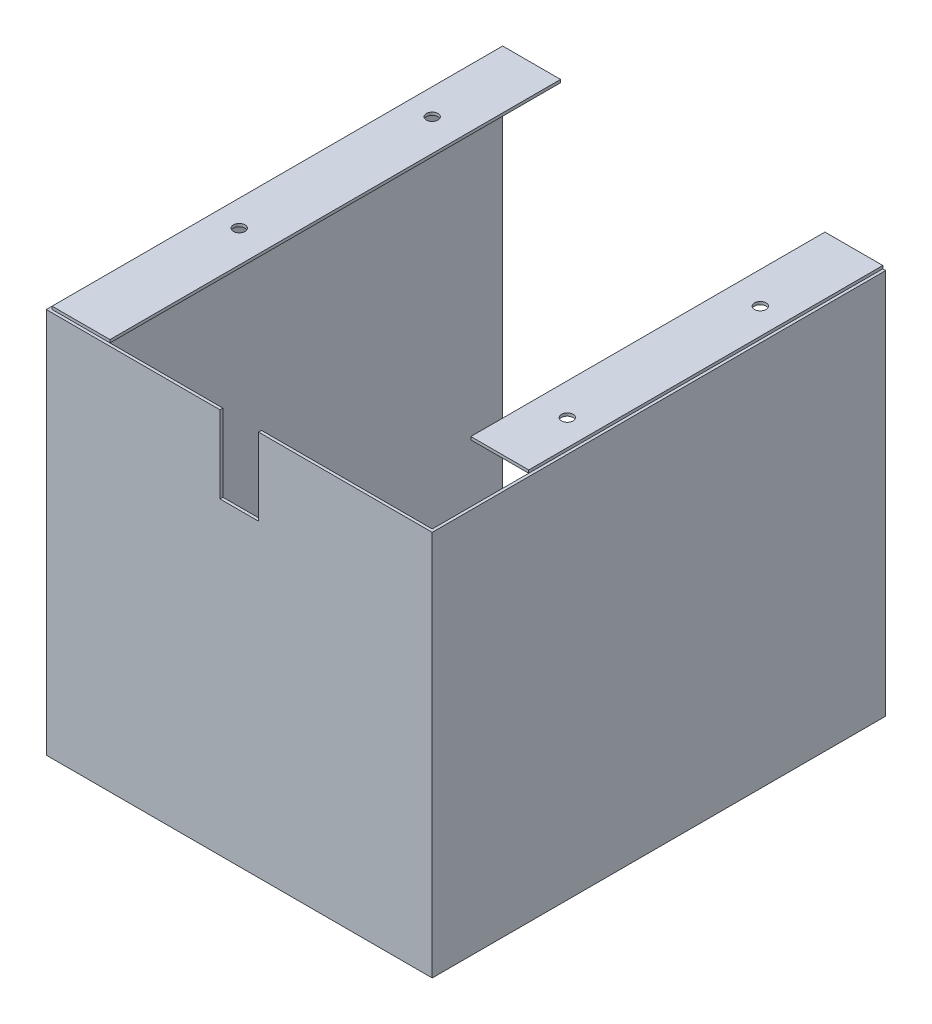
ISO-10303-21;
HEADER;
FILE_DESCRIPTION(('STEP AP214'),'2;1');
FILE_NAME('part.step','',(''),(''),'','','');
FILE_SCHEMA(('AUTOMOTIVE_DESIGN { 1 0 10303 214 1 1 1 1 }'));
ENDSEC;
DATA;
#1=APPLICATION_CONTEXT('core data for automotive mechanical design processes');
#2=APPLICATION_PROTOCOL_DEFINITION('international standard','automotive_design',2000,#1);
#3=PRODUCT_CONTEXT('',#1,'mechanical');
#4=PRODUCT('Part','Part','',(#3));
#5=PRODUCT_RELATED_PRODUCT_CATEGORY('part','',(#4));
#6=PRODUCT_DEFINITION_FORMATION('','',#4);
#7=PRODUCT_DEFINITION_CONTEXT('part definition',#1,'design');
#8=PRODUCT_DEFINITION('design','',#6,#7);
#9=PRODUCT_DEFINITION_SHAPE('','',#8);
#10=(LENGTH_UNIT() NAMED_UNIT(*) SI_UNIT(.MILLI.,.METRE.));
#11=(NAMED_UNIT(*) PLANE_ANGLE_UNIT() SI_UNIT($,.RADIAN.));
#12=(NAMED_UNIT(*) SI_UNIT($,.STERADIAN.) SOLID_ANGLE_UNIT());
#13=UNCERTAINTY_MEASURE_WITH_UNIT(LENGTH_MEASURE(1.E-05),#10,'distance_accuracy_value','');
#14=(GEOMETRIC_REPRESENTATION_CONTEXT(3) GLOBAL_UNCERTAINTY_ASSIGNED_CONTEXT((#13)) GLOBAL_UNIT_ASSIGNED_CONTEXT((#10,
#11,#12)) REPRESENTATION_CONTEXT('',''));
#15=CARTESIAN_POINT('',(0.,0.,0.));
#16=DIRECTION('',(0.,0.,1.));
#17=DIRECTION('',(1.,0.,0.));
#18=AXIS2_PLACEMENT_3D('',#15,#16,#17);
#19=CARTESIAN_POINT('',(98.5,101.5,0.));
#20=DIRECTION('',(-1.,0.,0.));
#21=DIRECTION('',(0.,-1.,0.));
#22=AXIS2_PLACEMENT_3D('',#19,#20,#21);
#23=PLANE('',#22);
#24=DIRECTION('',(0.,0.,-1.));
#25=VECTOR('',#24,1.);
#26=CARTESIAN_POINT('',(98.5,100.,0.));
#27=LINE('',#26,#25);
#28=CARTESIAN_POINT('',(98.5,100.,183.5));
#29=VERTEX_POINT('',#28);
#30=CARTESIAN_POINT('',(98.5,100.,0.));
#31=VERTEX_POINT('',#30);
#32=EDGE_CURVE('E117',#29,#31,#27,.T.);
#33=ORIENTED_EDGE('',*,*,#32,.T.);
#34=DIRECTION('',(0.,-1.,0.));
#35=VECTOR('',#34,1.);
#36=CARTESIAN_POINT('',(98.5,101.5,0.));
#37=LINE('',#36,#35);
#38=CARTESIAN_POINT('',(98.5,101.5,0.));
#39=VERTEX_POINT('',#38);
#40=EDGE_CURVE('E12',#39,#31,#37,.T.);
#41=ORIENTED_EDGE('',*,*,#40,.F.);
#42=DIRECTION('',(0.,0.,-1.));
#43=VECTOR('',#42,1.);
#44=CARTESIAN_POINT('',(98.5,101.5,0.));
#45=LINE('',#44,#43);
#46=CARTESIAN_POINT('',(98.5,101.5,183.5));
#47=VERTEX_POINT('',#46);
#48=EDGE_CURVE('E105',#47,#39,#45,.T.);
#49=ORIENTED_EDGE('',*,*,#48,.F.);
#50=DIRECTION('',(0.,-1.,0.));
#51=VECTOR('',#50,1.);
#52=CARTESIAN_POINT('',(98.5,101.5,183.5));
#53=LINE('',#52,#51);
#54=EDGE_CURVE('E113',#47,#29,#53,.T.);
#55=ORIENTED_EDGE('',*,*,#54,.T.);
#56=EDGE_LOOP('',(#33,#41,#49,#55));
#57=FACE_BOUND('',#56,.T.);
#58=ADVANCED_FACE('F54',(#57),#23,.F.);
#59=CARTESIAN_POINT('',(98.5,101.5,0.));
#60=DIRECTION('',(0.,0.,1.));
#61=DIRECTION('',(1.,0.,0.));
#62=AXIS2_PLACEMENT_3D('',#59,#60,#61);
#63=PLANE('',#62);
#64=DIRECTION('',(-1.,0.,0.));
#65=VECTOR('',#64,1.);
#66=CARTESIAN_POINT('',(98.5,100.,0.));
#67=LINE('',#66,#65);
#68=CARTESIAN_POINT('',(68.5,100.,0.));
#69=VERTEX_POINT('',#68);
#70=EDGE_CURVE('E109',#31,#69,#67,.T.);
#71=ORIENTED_EDGE('',*,*,#70,.T.);
#72=DIRECTION('',(0.,-1.,0.));
#73=VECTOR('',#72,1.);
#74=CARTESIAN_POINT('',(68.5,101.5,0.));
#75=LINE('',#74,#73);
#76=CARTESIAN_POINT('',(68.5,101.5,0.));
#77=VERTEX_POINT('',#76);
#78=EDGE_CURVE('E62',#77,#69,#75,.T.);
#79=ORIENTED_EDGE('',*,*,#78,.F.);
#80=DIRECTION('',(-1.,0.,0.));
#81=VECTOR('',#80,1.);
#82=CARTESIAN_POINT('',(98.5,101.5,0.));
#83=LINE('',#82,#81);
#84=EDGE_CURVE('E100',#39,#77,#83,.T.);
#85=ORIENTED_EDGE('',*,*,#84,.F.);
#86=ORIENTED_EDGE('',*,*,#40,.T.);
#87=EDGE_LOOP('',(#71,#79,#85,#86));
#88=FACE_BOUND('',#87,.T.);
#89=ADVANCED_FACE('F108',(#88),#63,.F.);
#90=CARTESIAN_POINT('',(68.5,101.5,0.));
#91=DIRECTION('',(1.,0.,0.));
#92=DIRECTION('',(0.,0.,-1.));
#93=AXIS2_PLACEMENT_3D('',#90,#91,#92);
#94=PLANE('',#93);
#95=DIRECTION('',(0.,0.,1.));
#96=VECTOR('',#95,1.);
#97=CARTESIAN_POINT('',(68.5,100.,0.));
#98=LINE('',#97,#96);
#99=CARTESIAN_POINT('',(68.5,100.,183.5));
#100=VERTEX_POINT('',#99);
#101=EDGE_CURVE('E87',#69,#100,#98,.T.);
#102=ORIENTED_EDGE('',*,*,#101,.T.);
#103=DIRECTION('',(0.,-1.,0.));
#104=VECTOR('',#103,1.);
#105=CARTESIAN_POINT('',(68.5,101.5,183.5));
#106=LINE('',#105,#104);
#107=CARTESIAN_POINT('',(68.5,101.5,183.5));
#108=VERTEX_POINT('',#107);
#109=EDGE_CURVE('E110',#108,#100,#106,.T.);
#110=ORIENTED_EDGE('',*,*,#109,.F.);
#111=DIRECTION('',(0.,0.,1.));
#112=VECTOR('',#111,1.);
#113=CARTESIAN_POINT('',(68.5,101.5,0.));
#114=LINE('',#113,#112);
#115=EDGE_CURVE('E103',#77,#108,#114,.T.);
#116=ORIENTED_EDGE('',*,*,#115,.F.);
#117=ORIENTED_EDGE('',*,*,#78,.T.);
#118=EDGE_LOOP('',(#102,#110,#116,#117));
#119=FACE_BOUND('',#118,.T.);
#120=ADVANCED_FACE('F111',(#119),#94,.F.);
#121=CARTESIAN_POINT('',(68.5,101.5,183.5));
#122=DIRECTION('',(0.,0.,-1.));
#123=DIRECTION('',(-1.,0.,0.));
#124=AXIS2_PLACEMENT_3D('',#121,#122,#123);
#125=PLANE('',#124);
#126=DIRECTION('',(1.,0.,0.));
#127=VECTOR('',#126,1.);
#128=CARTESIAN_POINT('',(68.5,100.,183.5));
#129=LINE('',#128,#127);
#130=EDGE_CURVE('E93',#100,#29,#129,.T.);
#131=ORIENTED_EDGE('',*,*,#130,.T.);
#132=ORIENTED_EDGE('',*,*,#54,.F.);
#133=DIRECTION('',(1.,0.,0.));
#134=VECTOR('',#133,1.);
#135=CARTESIAN_POINT('',(68.5,101.5,183.5));
#136=LINE('',#135,#134);
#137=EDGE_CURVE('E70',#108,#47,#136,.T.);
#138=ORIENTED_EDGE('',*,*,#137,.F.);
#139=ORIENTED_EDGE('',*,*,#109,.T.);
#140=EDGE_LOOP('',(#131,#132,#138,#139));
#141=FACE_BOUND('',#140,.T.);
#142=ADVANCED_FACE('F125',(#141),#125,.F.);
#143=CARTESIAN_POINT('',(0.,101.5,0.));
#144=DIRECTION('',(0.,1.,0.));
#145=DIRECTION('',(0.,0.,1.));
#146=AXIS2_PLACEMENT_3D('',#143,#144,#145);
#147=PLANE('',#146);
#148=CARTESIAN_POINT('',(85.0000000000001,101.5,150.));
#149=DIRECTION('',(0.,1.,0.));
#150=DIRECTION('',(0.,0.,-1.));
#151=AXIS2_PLACEMENT_3D('',#148,#149,#150);
#152=CIRCLE('',#151,3.00000000000001);
#153=CARTESIAN_POINT('',(85.0000000000001,101.5,147.));
#154=VERTEX_POINT('',#153);
#155=EDGE_CURVE('E137',#154,#154,#152,.T.);
#156=ORIENTED_EDGE('',*,*,#155,.F.);
#157=EDGE_LOOP('',(#156));
#158=FACE_BOUND('',#157,.T.);
#159=CARTESIAN_POINT('',(85.,101.5,50.));
#160=DIRECTION('',(0.,1.,0.));
#161=DIRECTION('',(0.,0.,-1.));
#162=AXIS2_PLACEMENT_3D('',#159,#160,#161);
#163=CIRCLE('',#162,3.00000000000001);
#164=CARTESIAN_POINT('',(85.,101.5,47.));
#165=VERTEX_POINT('',#164);
#166=EDGE_CURVE('E131',#165,#165,#163,.T.);
#167=ORIENTED_EDGE('',*,*,#166,.F.);
#168=EDGE_LOOP('',(#167));
#169=FACE_BOUND('',#168,.T.);
#170=ORIENTED_EDGE('',*,*,#48,.T.);
#171=ORIENTED_EDGE('',*,*,#84,.T.);
#172=ORIENTED_EDGE('',*,*,#115,.T.);
#173=ORIENTED_EDGE('',*,*,#137,.T.);
#174=EDGE_LOOP('',(#170,#171,#172,#173));
#175=FACE_BOUND('',#174,.T.);
#176=ADVANCED_FACE('F101',(#158,#169,#175),#147,.T.);
#177=CARTESIAN_POINT('',(0.,100.,0.));
#178=DIRECTION('',(0.,1.,0.));
#179=DIRECTION('',(0.,0.,1.));
#180=AXIS2_PLACEMENT_3D('',#177,#178,#179);
#181=PLANE('',#180);
#182=CARTESIAN_POINT('',(85.0000000000001,100.,150.));
#183=DIRECTION('',(0.,1.,0.));
#184=DIRECTION('',(0.,0.,-1.));
#185=AXIS2_PLACEMENT_3D('',#182,#183,#184);
#186=CIRCLE('',#185,3.00000000000001);
#187=CARTESIAN_POINT('',(85.0000000000001,100.,147.));
#188=VERTEX_POINT('',#187);
#189=EDGE_CURVE('E120',#188,#188,#186,.T.);
#190=ORIENTED_EDGE('',*,*,#189,.T.);
#191=EDGE_LOOP('',(#190));
#192=FACE_BOUND('',#191,.T.);
#193=CARTESIAN_POINT('',(85.,100.,50.));
#194=DIRECTION('',(0.,1.,0.));
#195=DIRECTION('',(0.,0.,-1.));
#196=AXIS2_PLACEMENT_3D('',#193,#194,#195);
#197=CIRCLE('',#196,3.00000000000001);
#198=CARTESIAN_POINT('',(85.,100.,47.));
#199=VERTEX_POINT('',#198);
#200=EDGE_CURVE('E134',#199,#199,#197,.T.);
#201=ORIENTED_EDGE('',*,*,#200,.T.);
#202=EDGE_LOOP('',(#201));
#203=FACE_BOUND('',#202,.T.);
#204=ORIENTED_EDGE('',*,*,#32,.F.);
#205=ORIENTED_EDGE('',*,*,#130,.F.);
#206=ORIENTED_EDGE('',*,*,#101,.F.);
#207=ORIENTED_EDGE('',*,*,#70,.F.);
#208=EDGE_LOOP('',(#204,#205,#206,#207));
#209=FACE_BOUND('',#208,.T.);
#210=ADVANCED_FACE('F128',(#192,#203,#209),#181,.F.);
#211=CARTESIAN_POINT('',(85.,100.,50.));
#212=DIRECTION('',(0.,1.,0.));
#213=DIRECTION('',(0.,0.,1.));
#214=AXIS2_PLACEMENT_3D('',#211,#212,#213);
#215=CYLINDRICAL_SURFACE('',#214,3.00000000000001);
#216=ORIENTED_EDGE('',*,*,#200,.F.);
#217=EDGE_LOOP('',(#216));
#218=FACE_BOUND('',#217,.T.);
#219=ORIENTED_EDGE('',*,*,#166,.T.);
#220=EDGE_LOOP('',(#219));
#221=FACE_BOUND('',#220,.T.);
#222=ADVANCED_FACE('F148',(#218,#221),#215,.F.);
#223=CARTESIAN_POINT('',(85.0000000000001,100.,150.));
#224=DIRECTION('',(0.,1.,0.));
#225=DIRECTION('',(0.,0.,1.));
#226=AXIS2_PLACEMENT_3D('',#223,#224,#225);
#227=CYLINDRICAL_SURFACE('',#226,3.00000000000001);
#228=ORIENTED_EDGE('',*,*,#189,.F.);
#229=EDGE_LOOP('',(#228));
#230=FACE_BOUND('',#229,.T.);
#231=ORIENTED_EDGE('',*,*,#155,.T.);
#232=EDGE_LOOP('',(#231));
#233=FACE_BOUND('',#232,.T.);
#234=ADVANCED_FACE('F145',(#230,#233),#227,.F.);
#235=CLOSED_SHELL('',(#58,#89,#120,#142,#176,#210,#222,#234));
#236=MANIFOLD_SOLID_BREP('B2',#235);
#237=CARTESIAN_POINT('',(-98.5,101.5,0.));
#238=DIRECTION('',(1.,0.,0.));
#239=DIRECTION('',(0.,1.,0.));
#240=AXIS2_PLACEMENT_3D('',#237,#238,#239);
#241=PLANE('',#240);
#242=DIRECTION('',(0.,0.,1.));
#243=VECTOR('',#242,1.);
#244=CARTESIAN_POINT('',(-98.5,100.,0.));
#245=LINE('',#244,#243);
#246=CARTESIAN_POINT('',(-98.5,100.,0.));
#247=VERTEX_POINT('',#246);
#248=CARTESIAN_POINT('',(-98.5,100.,233.5));
#249=VERTEX_POINT('',#248);
#250=EDGE_CURVE('E297',#247,#249,#245,.T.);
#251=ORIENTED_EDGE('',*,*,#250,.T.);
#252=DIRECTION('',(0.,-1.,0.));
#253=VECTOR('',#252,1.);
#254=CARTESIAN_POINT('',(-98.5,101.5,233.5));
#255=LINE('',#254,#253);
#256=CARTESIAN_POINT('',(-98.5,101.5,233.5));
#257=VERTEX_POINT('',#256);
#258=EDGE_CURVE('E52',#257,#249,#255,.T.);
#259=ORIENTED_EDGE('',*,*,#258,.F.);
#260=DIRECTION('',(0.,0.,1.));
#261=VECTOR('',#260,1.);
#262=CARTESIAN_POINT('',(-98.5,101.5,0.));
#263=LINE('',#262,#261);
#264=CARTESIAN_POINT('',(-98.5,101.5,0.));
#265=VERTEX_POINT('',#264);
#266=EDGE_CURVE('E285',#265,#257,#263,.T.);
#267=ORIENTED_EDGE('',*,*,#266,.F.);
#268=DIRECTION('',(0.,-1.,0.));
#269=VECTOR('',#268,1.);
#270=CARTESIAN_POINT('',(-98.5,101.5,0.));
#271=LINE('',#270,#269);
#272=EDGE_CURVE('E293',#265,#247,#271,.T.);
#273=ORIENTED_EDGE('',*,*,#272,.T.);
#274=EDGE_LOOP('',(#251,#259,#267,#273));
#275=FACE_BOUND('',#274,.T.);
#276=ADVANCED_FACE('F234',(#275),#241,.F.);
#277=CARTESIAN_POINT('',(-98.5,101.5,233.5));
#278=DIRECTION('',(0.,0.,-1.));
#279=DIRECTION('',(-1.,0.,0.));
#280=AXIS2_PLACEMENT_3D('',#277,#278,#279);
#281=PLANE('',#280);
#282=DIRECTION('',(1.,0.,0.));
#283=VECTOR('',#282,1.);
#284=CARTESIAN_POINT('',(-98.5,100.,233.5));
#285=LINE('',#284,#283);
#286=CARTESIAN_POINT('',(-68.5,100.,233.5));
#287=VERTEX_POINT('',#286);
#288=EDGE_CURVE('E289',#249,#287,#285,.T.);
#289=ORIENTED_EDGE('',*,*,#288,.T.);
#290=DIRECTION('',(0.,-1.,0.));
#291=VECTOR('',#290,1.);
#292=CARTESIAN_POINT('',(-68.5,101.5,233.5));
#293=LINE('',#292,#291);
#294=CARTESIAN_POINT('',(-68.5,101.5,233.5));
#295=VERTEX_POINT('',#294);
#296=EDGE_CURVE('E242',#295,#287,#293,.T.);
#297=ORIENTED_EDGE('',*,*,#296,.F.);
#298=DIRECTION('',(1.,0.,0.));
#299=VECTOR('',#298,1.);
#300=CARTESIAN_POINT('',(-98.5,101.5,233.5));
#301=LINE('',#300,#299);
#302=EDGE_CURVE('E280',#257,#295,#301,.T.);
#303=ORIENTED_EDGE('',*,*,#302,.F.);
#304=ORIENTED_EDGE('',*,*,#258,.T.);
#305=EDGE_LOOP('',(#289,#297,#303,#304));
#306=FACE_BOUND('',#305,.T.);
#307=ADVANCED_FACE('F288',(#306),#281,.F.);
#308=CARTESIAN_POINT('',(-68.5,101.5,0.));
#309=DIRECTION('',(-1.,0.,0.));
#310=DIRECTION('',(0.,-1.,0.));
#311=AXIS2_PLACEMENT_3D('',#308,#309,#310);
#312=PLANE('',#311);
#313=DIRECTION('',(0.,0.,-1.));
#314=VECTOR('',#313,1.);
#315=CARTESIAN_POINT('',(-68.5,100.,0.));
#316=LINE('',#315,#314);
#317=CARTESIAN_POINT('',(-68.5,100.,0.));
#318=VERTEX_POINT('',#317);
#319=EDGE_CURVE('E267',#287,#318,#316,.T.);
#320=ORIENTED_EDGE('',*,*,#319,.T.);
#321=DIRECTION('',(0.,-1.,0.));
#322=VECTOR('',#321,1.);
#323=CARTESIAN_POINT('',(-68.5,101.5,0.));
#324=LINE('',#323,#322);
#325=CARTESIAN_POINT('',(-68.5,101.5,0.));
#326=VERTEX_POINT('',#325);
#327=EDGE_CURVE('E290',#326,#318,#324,.T.);
#328=ORIENTED_EDGE('',*,*,#327,.F.);
#329=DIRECTION('',(0.,0.,-1.));
#330=VECTOR('',#329,1.);
#331=CARTESIAN_POINT('',(-68.5,101.5,0.));
#332=LINE('',#331,#330);
#333=EDGE_CURVE('E283',#295,#326,#332,.T.);
#334=ORIENTED_EDGE('',*,*,#333,.F.);
#335=ORIENTED_EDGE('',*,*,#296,.T.);
#336=EDGE_LOOP('',(#320,#328,#334,#335));
#337=FACE_BOUND('',#336,.T.);
#338=ADVANCED_FACE('F291',(#337),#312,.F.);
#339=CARTESIAN_POINT('',(-98.5,101.5,0.));
#340=DIRECTION('',(0.,0.,1.));
#341=DIRECTION('',(1.,0.,0.));
#342=AXIS2_PLACEMENT_3D('',#339,#340,#341);
#343=PLANE('',#342);
#344=DIRECTION('',(-1.,0.,0.));
#345=VECTOR('',#344,1.);
#346=CARTESIAN_POINT('',(-98.5,100.,0.));
#347=LINE('',#346,#345);
#348=EDGE_CURVE('E273',#318,#247,#347,.T.);
#349=ORIENTED_EDGE('',*,*,#348,.T.);
#350=ORIENTED_EDGE('',*,*,#272,.F.);
#351=DIRECTION('',(-1.,0.,0.));
#352=VECTOR('',#351,1.);
#353=CARTESIAN_POINT('',(-98.5,101.5,0.));
#354=LINE('',#353,#352);
#355=EDGE_CURVE('E250',#326,#265,#354,.T.);
#356=ORIENTED_EDGE('',*,*,#355,.F.);
#357=ORIENTED_EDGE('',*,*,#327,.T.);
#358=EDGE_LOOP('',(#349,#350,#356,#357));
#359=FACE_BOUND('',#358,.T.);
#360=ADVANCED_FACE('F305',(#359),#343,.F.);
#361=CARTESIAN_POINT('',(0.,101.5,0.));
#362=DIRECTION('',(0.,1.,0.));
#363=DIRECTION('',(0.,0.,1.));
#364=AXIS2_PLACEMENT_3D('',#361,#362,#363);
#365=PLANE('',#364);
#366=CARTESIAN_POINT('',(-85.,101.5,50.));
#367=DIRECTION('',(0.,1.,0.));
#368=DIRECTION('',(0.,0.,1.));
#369=AXIS2_PLACEMENT_3D('',#366,#367,#368);
#370=CIRCLE('',#369,3.00000000000001);
#371=CARTESIAN_POINT('',(-85.,101.5,53.));
#372=VERTEX_POINT('',#371);
#373=EDGE_CURVE('E317',#372,#372,#370,.T.);
#374=ORIENTED_EDGE('',*,*,#373,.F.);
#375=EDGE_LOOP('',(#374));
#376=FACE_BOUND('',#375,.T.);
#377=CARTESIAN_POINT('',(-85.,101.5,150.));
#378=DIRECTION('',(0.,1.,0.));
#379=DIRECTION('',(0.,0.,1.));
#380=AXIS2_PLACEMENT_3D('',#377,#378,#379);
#381=CIRCLE('',#380,3.00000000000001);
#382=CARTESIAN_POINT('',(-85.,101.5,153.));
#383=VERTEX_POINT('',#382);
#384=EDGE_CURVE('E311',#383,#383,#381,.T.);
#385=ORIENTED_EDGE('',*,*,#384,.F.);
#386=EDGE_LOOP('',(#385));
#387=FACE_BOUND('',#386,.T.);
#388=ORIENTED_EDGE('',*,*,#266,.T.);
#389=ORIENTED_EDGE('',*,*,#302,.T.);
#390=ORIENTED_EDGE('',*,*,#333,.T.);
#391=ORIENTED_EDGE('',*,*,#355,.T.);
#392=EDGE_LOOP('',(#388,#389,#390,#391));
#393=FACE_BOUND('',#392,.T.);
#394=ADVANCED_FACE('F281',(#376,#387,#393),#365,.T.);
#395=CARTESIAN_POINT('',(0.,100.,0.));
#396=DIRECTION('',(0.,1.,0.));
#397=DIRECTION('',(0.,0.,1.));
#398=AXIS2_PLACEMENT_3D('',#395,#396,#397);
#399=PLANE('',#398);
#400=CARTESIAN_POINT('',(-85.,100.,50.));
#401=DIRECTION('',(0.,1.,0.));
#402=DIRECTION('',(0.,0.,1.));
#403=AXIS2_PLACEMENT_3D('',#400,#401,#402);
#404=CIRCLE('',#403,3.00000000000001);
#405=CARTESIAN_POINT('',(-85.,100.,53.));
#406=VERTEX_POINT('',#405);
#407=EDGE_CURVE('E300',#406,#406,#404,.T.);
#408=ORIENTED_EDGE('',*,*,#407,.T.);
#409=EDGE_LOOP('',(#408));
#410=FACE_BOUND('',#409,.T.);
#411=CARTESIAN_POINT('',(-85.,100.,150.));
#412=DIRECTION('',(0.,1.,0.));
#413=DIRECTION('',(0.,0.,1.));
#414=AXIS2_PLACEMENT_3D('',#411,#412,#413);
#415=CIRCLE('',#414,3.00000000000001);
#416=CARTESIAN_POINT('',(-85.,100.,153.));
#417=VERTEX_POINT('',#416);
#418=EDGE_CURVE('E314',#417,#417,#415,.T.);
#419=ORIENTED_EDGE('',*,*,#418,.T.);
#420=EDGE_LOOP('',(#419));
#421=FACE_BOUND('',#420,.T.);
#422=ORIENTED_EDGE('',*,*,#250,.F.);
#423=ORIENTED_EDGE('',*,*,#348,.F.);
#424=ORIENTED_EDGE('',*,*,#319,.F.);
#425=ORIENTED_EDGE('',*,*,#288,.F.);
#426=EDGE_LOOP('',(#422,#423,#424,#425));
#427=FACE_BOUND('',#426,.T.);
#428=ADVANCED_FACE('F308',(#410,#421,#427),#399,.F.);
#429=CARTESIAN_POINT('',(-85.,100.,150.));
#430=DIRECTION('',(0.,1.,0.));
#431=DIRECTION('',(0.,0.,1.));
#432=AXIS2_PLACEMENT_3D('',#429,#430,#431);
#433=CYLINDRICAL_SURFACE('',#432,3.00000000000001);
#434=ORIENTED_EDGE('',*,*,#418,.F.);
#435=EDGE_LOOP('',(#434));
#436=FACE_BOUND('',#435,.T.);
#437=ORIENTED_EDGE('',*,*,#384,.T.);
#438=EDGE_LOOP('',(#437));
#439=FACE_BOUND('',#438,.T.);
#440=ADVANCED_FACE('F328',(#436,#439),#433,.F.);
#441=CARTESIAN_POINT('',(-85.,100.,50.));
#442=DIRECTION('',(0.,1.,0.));
#443=DIRECTION('',(0.,0.,1.));
#444=AXIS2_PLACEMENT_3D('',#441,#442,#443);
#445=CYLINDRICAL_SURFACE('',#444,3.00000000000001);
#446=ORIENTED_EDGE('',*,*,#407,.F.);
#447=EDGE_LOOP('',(#446));
#448=FACE_BOUND('',#447,.T.);
#449=ORIENTED_EDGE('',*,*,#373,.T.);
#450=EDGE_LOOP('',(#449));
#451=FACE_BOUND('',#450,.T.);
#452=ADVANCED_FACE('F325',(#448,#451),#445,.F.);
#453=CLOSED_SHELL('',(#276,#307,#338,#360,#394,#428,#440,#452));
#454=MANIFOLD_SOLID_BREP('B6',#453);
#455=CARTESIAN_POINT('',(100.,100.,235.));
#456=DIRECTION('',(0.,-1.,0.));
#457=DIRECTION('',(1.,0.,0.));
#458=AXIS2_PLACEMENT_3D('',#455,#456,#457);
#459=PLANE('',#458);
#460=DIRECTION('',(-1.,0.,0.));
#461=VECTOR('',#460,1.);
#462=CARTESIAN_POINT('',(100.,100.,235.));
#463=LINE('',#462,#461);
#464=CARTESIAN_POINT('',(-10.,100.,235.));
#465=VERTEX_POINT('',#464);
#466=CARTESIAN_POINT('',(-100.,100.,235.));
#467=VERTEX_POINT('',#466);
#468=EDGE_CURVE('E562',#465,#467,#463,.T.);
#469=ORIENTED_EDGE('',*,*,#468,.F.);
#470=DIRECTION('',(0.,0.,1.));
#471=VECTOR('',#470,1.);
#472=CARTESIAN_POINT('',(-10.,100.,-0.001000000000001));
#473=LINE('',#472,#471);
#474=CARTESIAN_POINT('',(-10.,100.,233.5));
#475=VERTEX_POINT('',#474);
#476=EDGE_CURVE('E509',#475,#465,#473,.T.);
#477=ORIENTED_EDGE('',*,*,#476,.F.);
#478=DIRECTION('',(-1.,0.,0.));
#479=VECTOR('',#478,1.);
#480=CARTESIAN_POINT('',(100.,100.,233.5));
#481=LINE('',#480,#479);
#482=CARTESIAN_POINT('',(-98.5,100.,233.5));
#483=VERTEX_POINT('',#482);
#484=EDGE_CURVE('E514',#475,#483,#481,.T.);
#485=ORIENTED_EDGE('',*,*,#484,.T.);
#486=DIRECTION('',(0.,0.,-1.));
#487=VECTOR('',#486,1.);
#488=CARTESIAN_POINT('',(-98.5,100.,235.));
#489=LINE('',#488,#487);
#490=CARTESIAN_POINT('',(-98.5,100.,0.));
#491=VERTEX_POINT('',#490);
#492=EDGE_CURVE('E544',#483,#491,#489,.T.);
#493=ORIENTED_EDGE('',*,*,#492,.T.);
#494=DIRECTION('',(-1.,0.,0.));
#495=VECTOR('',#494,1.);
#496=CARTESIAN_POINT('',(100.,100.,0.));
#497=LINE('',#496,#495);
#498=CARTESIAN_POINT('',(-100.,100.,0.));
#499=VERTEX_POINT('',#498);
#500=EDGE_CURVE('E573',#491,#499,#497,.T.);
#501=ORIENTED_EDGE('',*,*,#500,.T.);
#502=DIRECTION('',(0.,0.,-1.));
#503=VECTOR('',#502,1.);
#504=CARTESIAN_POINT('',(-100.,100.,235.));
#505=LINE('',#504,#503);
#506=EDGE_CURVE('E566',#467,#499,#505,.T.);
#507=ORIENTED_EDGE('',*,*,#506,.F.);
#508=EDGE_LOOP('',(#469,#477,#485,#493,#501,#507));
#509=FACE_BOUND('',#508,.T.);
#510=ADVANCED_FACE('F401',(#509),#459,.F.);
#511=CARTESIAN_POINT('',(-100.,-100.,235.));
#512=DIRECTION('',(1.,0.,0.));
#513=DIRECTION('',(0.,0.,-1.));
#514=AXIS2_PLACEMENT_3D('',#511,#512,#513);
#515=PLANE('',#514);
#516=DIRECTION('',(0.,-1.,0.));
#517=VECTOR('',#516,1.);
#518=CARTESIAN_POINT('',(-100.,-100.,0.));
#519=LINE('',#518,#517);
#520=CARTESIAN_POINT('',(-100.,-100.,0.));
#521=VERTEX_POINT('',#520);
#522=EDGE_CURVE('E530',#499,#521,#519,.T.);
#523=ORIENTED_EDGE('',*,*,#522,.T.);
#524=DIRECTION('',(0.,0.,-1.));
#525=VECTOR('',#524,1.);
#526=CARTESIAN_POINT('',(-100.,-100.,235.));
#527=LINE('',#526,#525);
#528=CARTESIAN_POINT('',(-100.,-100.,235.));
#529=VERTEX_POINT('',#528);
#530=EDGE_CURVE('E232',#529,#521,#527,.T.);
#531=ORIENTED_EDGE('',*,*,#530,.F.);
#532=DIRECTION('',(0.,-1.,0.));
#533=VECTOR('',#532,1.);
#534=CARTESIAN_POINT('',(-100.,-100.,235.));
#535=LINE('',#534,#533);
#536=EDGE_CURVE('E554',#467,#529,#535,.T.);
#537=ORIENTED_EDGE('',*,*,#536,.F.);
#538=ORIENTED_EDGE('',*,*,#506,.T.);
#539=EDGE_LOOP('',(#523,#531,#537,#538));
#540=FACE_BOUND('',#539,.T.);
#541=ADVANCED_FACE('F403',(#540),#515,.F.);
#542=CARTESIAN_POINT('',(100.,-100.,235.));
#543=DIRECTION('',(0.,1.,0.));
#544=DIRECTION('',(-1.,0.,0.));
#545=AXIS2_PLACEMENT_3D('',#542,#543,#544);
#546=PLANE('',#545);
#547=DIRECTION('',(1.,0.,0.));
#548=VECTOR('',#547,1.);
#549=CARTESIAN_POINT('',(100.,-100.,0.));
#550=LINE('',#549,#548);
#551=CARTESIAN_POINT('',(100.,-100.,0.));
#552=VERTEX_POINT('',#551);
#553=EDGE_CURVE('E569',#521,#552,#550,.T.);
#554=ORIENTED_EDGE('',*,*,#553,.T.);
#555=DIRECTION('',(0.,0.,-1.));
#556=VECTOR('',#555,1.);
#557=CARTESIAN_POINT('',(100.,-100.,235.));
#558=LINE('',#557,#556);
#559=CARTESIAN_POINT('',(100.,-100.,235.));
#560=VERTEX_POINT('',#559);
#561=EDGE_CURVE('E409',#560,#552,#558,.T.);
#562=ORIENTED_EDGE('',*,*,#561,.F.);
#563=DIRECTION('',(1.,0.,0.));
#564=VECTOR('',#563,1.);
#565=CARTESIAN_POINT('',(100.,-100.,235.));
#566=LINE('',#565,#564);
#567=EDGE_CURVE('E557',#529,#560,#566,.T.);
#568=ORIENTED_EDGE('',*,*,#567,.F.);
#569=ORIENTED_EDGE('',*,*,#530,.T.);
#570=EDGE_LOOP('',(#554,#562,#568,#569));
#571=FACE_BOUND('',#570,.T.);
#572=ADVANCED_FACE('F602',(#571),#546,.F.);
#573=CARTESIAN_POINT('',(100.,-100.,235.));
#574=DIRECTION('',(-1.,0.,0.));
#575=DIRECTION('',(0.,0.,1.));
#576=AXIS2_PLACEMENT_3D('',#573,#574,#575);
#577=PLANE('',#576);
#578=DIRECTION('',(0.,1.,0.));
#579=VECTOR('',#578,1.);
#580=CARTESIAN_POINT('',(100.,-100.,0.));
#581=LINE('',#580,#579);
#582=CARTESIAN_POINT('',(100.,100.,0.));
#583=VERTEX_POINT('',#582);
#584=EDGE_CURVE('E571',#552,#583,#581,.T.);
#585=ORIENTED_EDGE('',*,*,#584,.T.);
#586=DIRECTION('',(0.,0.,-1.));
#587=VECTOR('',#586,1.);
#588=CARTESIAN_POINT('',(100.,100.,235.));
#589=LINE('',#588,#587);
#590=CARTESIAN_POINT('',(100.,100.,235.));
#591=VERTEX_POINT('',#590);
#592=EDGE_CURVE('E578',#591,#583,#589,.T.);
#593=ORIENTED_EDGE('',*,*,#592,.F.);
#594=DIRECTION('',(0.,1.,0.));
#595=VECTOR('',#594,1.);
#596=CARTESIAN_POINT('',(100.,-100.,235.));
#597=LINE('',#596,#595);
#598=EDGE_CURVE('E560',#560,#591,#597,.T.);
#599=ORIENTED_EDGE('',*,*,#598,.F.);
#600=ORIENTED_EDGE('',*,*,#561,.T.);
#601=EDGE_LOOP('',(#585,#593,#599,#600));
#602=FACE_BOUND('',#601,.T.);
#603=ADVANCED_FACE('F585',(#602),#577,.F.);
#604=CARTESIAN_POINT('',(98.5,100.,233.5));
#605=VERTEX_POINT('',#604);
#606=CARTESIAN_POINT('',(10.,100.,233.5));
#607=VERTEX_POINT('',#606);
#608=EDGE_CURVE('E547',#605,#607,#481,.T.);
#609=ORIENTED_EDGE('',*,*,#608,.T.);
#610=DIRECTION('',(0.,0.,1.));
#611=VECTOR('',#610,1.);
#612=CARTESIAN_POINT('',(10.,100.,-0.001000000000001));
#613=LINE('',#612,#611);
#614=CARTESIAN_POINT('',(10.,100.,235.));
#615=VERTEX_POINT('',#614);
#616=EDGE_CURVE('E523',#607,#615,#613,.T.);
#617=ORIENTED_EDGE('',*,*,#616,.T.);
#618=EDGE_CURVE('E563',#591,#615,#463,.T.);
#619=ORIENTED_EDGE('',*,*,#618,.F.);
#620=ORIENTED_EDGE('',*,*,#592,.T.);
#621=CARTESIAN_POINT('',(98.5,100.,0.));
#622=VERTEX_POINT('',#621);
#623=EDGE_CURVE('E558',#583,#622,#497,.T.);
#624=ORIENTED_EDGE('',*,*,#623,.T.);
#625=DIRECTION('',(0.,0.,-1.));
#626=VECTOR('',#625,1.);
#627=CARTESIAN_POINT('',(98.5,100.,235.));
#628=LINE('',#627,#626);
#629=EDGE_CURVE('E537',#605,#622,#628,.T.);
#630=ORIENTED_EDGE('',*,*,#629,.F.);
#631=EDGE_LOOP('',(#609,#617,#619,#620,#624,#630));
#632=FACE_BOUND('',#631,.T.);
#633=ADVANCED_FACE('F595',(#632),#459,.F.);
#634=CARTESIAN_POINT('',(0.,0.,235.));
#635=DIRECTION('',(0.,0.,1.));
#636=DIRECTION('',(1.,0.,0.));
#637=AXIS2_PLACEMENT_3D('',#634,#635,#636);
#638=PLANE('',#637);
#639=DIRECTION('',(0.,-1.,0.));
#640=VECTOR('',#639,1.);
#641=CARTESIAN_POINT('',(-10.,100.,235.));
#642=LINE('',#641,#640);
#643=CARTESIAN_POINT('',(-9.99999999999999,60.,235.));
#644=VERTEX_POINT('',#643);
#645=EDGE_CURVE('E497',#465,#644,#642,.T.);
#646=ORIENTED_EDGE('',*,*,#645,.F.);
#647=ORIENTED_EDGE('',*,*,#468,.T.);
#648=ORIENTED_EDGE('',*,*,#536,.T.);
#649=ORIENTED_EDGE('',*,*,#567,.T.);
#650=ORIENTED_EDGE('',*,*,#598,.T.);
#651=ORIENTED_EDGE('',*,*,#618,.T.);
#652=DIRECTION('',(0.,1.,0.));
#653=VECTOR('',#652,1.);
#654=CARTESIAN_POINT('',(10.,100.,235.));
#655=LINE('',#654,#653);
#656=CARTESIAN_POINT('',(10.,60.,235.));
#657=VERTEX_POINT('',#656);
#658=EDGE_CURVE('E502',#657,#615,#655,.T.);
#659=ORIENTED_EDGE('',*,*,#658,.F.);
#660=DIRECTION('',(1.,0.,0.));
#661=VECTOR('',#660,1.);
#662=CARTESIAN_POINT('',(-9.99999999999999,60.,235.));
#663=LINE('',#662,#661);
#664=EDGE_CURVE('E516',#644,#657,#663,.T.);
#665=ORIENTED_EDGE('',*,*,#664,.F.);
#666=EDGE_LOOP('',(#646,#647,#648,#649,#650,#651,#659,#665));
#667=FACE_BOUND('',#666,.T.);
#668=ADVANCED_FACE('F599',(#667),#638,.T.);
#669=CARTESIAN_POINT('',(0.,0.,0.));
#670=DIRECTION('',(0.,0.,1.));
#671=DIRECTION('',(1.,0.,0.));
#672=AXIS2_PLACEMENT_3D('',#669,#670,#671);
#673=PLANE('',#672);
#674=ORIENTED_EDGE('',*,*,#500,.F.);
#675=DIRECTION('',(0.,-1.,0.));
#676=VECTOR('',#675,1.);
#677=CARTESIAN_POINT('',(-98.5,-100.,0.));
#678=LINE('',#677,#676);
#679=CARTESIAN_POINT('',(-98.5,-98.5,0.));
#680=VERTEX_POINT('',#679);
#681=EDGE_CURVE('E508',#491,#680,#678,.T.);
#682=ORIENTED_EDGE('',*,*,#681,.T.);
#683=DIRECTION('',(1.,0.,0.));
#684=VECTOR('',#683,1.);
#685=CARTESIAN_POINT('',(100.,-98.5,0.));
#686=LINE('',#685,#684);
#687=CARTESIAN_POINT('',(98.5,-98.5,0.));
#688=VERTEX_POINT('',#687);
#689=EDGE_CURVE('E543',#680,#688,#686,.T.);
#690=ORIENTED_EDGE('',*,*,#689,.T.);
#691=DIRECTION('',(0.,1.,0.));
#692=VECTOR('',#691,1.);
#693=CARTESIAN_POINT('',(98.5,-100.,0.));
#694=LINE('',#693,#692);
#695=EDGE_CURVE('E424',#688,#622,#694,.T.);
#696=ORIENTED_EDGE('',*,*,#695,.T.);
#697=ORIENTED_EDGE('',*,*,#623,.F.);
#698=ORIENTED_EDGE('',*,*,#584,.F.);
#699=ORIENTED_EDGE('',*,*,#553,.F.);
#700=ORIENTED_EDGE('',*,*,#522,.F.);
#701=EDGE_LOOP('',(#674,#682,#690,#696,#697,#698,#699,#700));
#702=FACE_BOUND('',#701,.T.);
#703=ADVANCED_FACE('F591',(#702),#673,.F.);
#704=CARTESIAN_POINT('',(-98.5,-100.,235.));
#705=DIRECTION('',(1.,0.,0.));
#706=DIRECTION('',(0.,0.,-1.));
#707=AXIS2_PLACEMENT_3D('',#704,#705,#706);
#708=PLANE('',#707);
#709=ORIENTED_EDGE('',*,*,#681,.F.);
#710=ORIENTED_EDGE('',*,*,#492,.F.);
#711=DIRECTION('',(0.,-1.,0.));
#712=VECTOR('',#711,1.);
#713=CARTESIAN_POINT('',(-98.5,-100.,233.5));
#714=LINE('',#713,#712);
#715=CARTESIAN_POINT('',(-98.5,-98.5,233.5));
#716=VERTEX_POINT('',#715);
#717=EDGE_CURVE('E532',#483,#716,#714,.T.);
#718=ORIENTED_EDGE('',*,*,#717,.T.);
#719=DIRECTION('',(0.,0.,-1.));
#720=VECTOR('',#719,1.);
#721=CARTESIAN_POINT('',(-98.5,-98.5,235.));
#722=LINE('',#721,#720);
#723=EDGE_CURVE('E527',#716,#680,#722,.T.);
#724=ORIENTED_EDGE('',*,*,#723,.T.);
#725=EDGE_LOOP('',(#709,#710,#718,#724));
#726=FACE_BOUND('',#725,.T.);
#727=ADVANCED_FACE('F609',(#726),#708,.T.);
#728=CARTESIAN_POINT('',(100.,-98.5,235.));
#729=DIRECTION('',(0.,1.,0.));
#730=DIRECTION('',(-1.,0.,0.));
#731=AXIS2_PLACEMENT_3D('',#728,#729,#730);
#732=PLANE('',#731);
#733=ORIENTED_EDGE('',*,*,#689,.F.);
#734=ORIENTED_EDGE('',*,*,#723,.F.);
#735=DIRECTION('',(1.,0.,0.));
#736=VECTOR('',#735,1.);
#737=CARTESIAN_POINT('',(100.,-98.5,233.5));
#738=LINE('',#737,#736);
#739=CARTESIAN_POINT('',(98.5,-98.5,233.5));
#740=VERTEX_POINT('',#739);
#741=EDGE_CURVE('E535',#716,#740,#738,.T.);
#742=ORIENTED_EDGE('',*,*,#741,.T.);
#743=DIRECTION('',(0.,0.,-1.));
#744=VECTOR('',#743,1.);
#745=CARTESIAN_POINT('',(98.5,-98.5,235.));
#746=LINE('',#745,#744);
#747=EDGE_CURVE('E531',#740,#688,#746,.T.);
#748=ORIENTED_EDGE('',*,*,#747,.T.);
#749=EDGE_LOOP('',(#733,#734,#742,#748));
#750=FACE_BOUND('',#749,.T.);
#751=ADVANCED_FACE('F614',(#750),#732,.T.);
#752=CARTESIAN_POINT('',(98.5,-100.,235.));
#753=DIRECTION('',(-1.,0.,0.));
#754=DIRECTION('',(0.,0.,1.));
#755=AXIS2_PLACEMENT_3D('',#752,#753,#754);
#756=PLANE('',#755);
#757=ORIENTED_EDGE('',*,*,#695,.F.);
#758=ORIENTED_EDGE('',*,*,#747,.F.);
#759=DIRECTION('',(0.,1.,0.));
#760=VECTOR('',#759,1.);
#761=CARTESIAN_POINT('',(98.5,-100.,233.5));
#762=LINE('',#761,#760);
#763=EDGE_CURVE('E539',#740,#605,#762,.T.);
#764=ORIENTED_EDGE('',*,*,#763,.T.);
#765=ORIENTED_EDGE('',*,*,#629,.T.);
#766=EDGE_LOOP('',(#757,#758,#764,#765));
#767=FACE_BOUND('',#766,.T.);
#768=ADVANCED_FACE('F615',(#767),#756,.T.);
#769=CARTESIAN_POINT('',(0.,0.,233.5));
#770=DIRECTION('',(0.,0.,1.));
#771=DIRECTION('',(1.,0.,0.));
#772=AXIS2_PLACEMENT_3D('',#769,#770,#771);
#773=PLANE('',#772);
#774=ORIENTED_EDGE('',*,*,#484,.F.);
#775=DIRECTION('',(0.,1.,0.));
#776=VECTOR('',#775,1.);
#777=CARTESIAN_POINT('',(-10.,100.,233.5));
#778=LINE('',#777,#776);
#779=CARTESIAN_POINT('',(-9.99999999999999,60.,233.5));
#780=VERTEX_POINT('',#779);
#781=EDGE_CURVE('E494',#780,#475,#778,.T.);
#782=ORIENTED_EDGE('',*,*,#781,.F.);
#783=DIRECTION('',(-1.,0.,0.));
#784=VECTOR('',#783,1.);
#785=CARTESIAN_POINT('',(-9.99999999999999,60.,233.5));
#786=LINE('',#785,#784);
#787=CARTESIAN_POINT('',(10.,60.,233.5));
#788=VERTEX_POINT('',#787);
#789=EDGE_CURVE('E505',#788,#780,#786,.T.);
#790=ORIENTED_EDGE('',*,*,#789,.F.);
#791=DIRECTION('',(0.,-1.,0.));
#792=VECTOR('',#791,1.);
#793=CARTESIAN_POINT('',(10.,100.,233.5));
#794=LINE('',#793,#792);
#795=EDGE_CURVE('E416',#607,#788,#794,.T.);
#796=ORIENTED_EDGE('',*,*,#795,.F.);
#797=ORIENTED_EDGE('',*,*,#608,.F.);
#798=ORIENTED_EDGE('',*,*,#763,.F.);
#799=ORIENTED_EDGE('',*,*,#741,.F.);
#800=ORIENTED_EDGE('',*,*,#717,.F.);
#801=EDGE_LOOP('',(#774,#782,#790,#796,#797,#798,#799,#800));
#802=FACE_BOUND('',#801,.T.);
#803=ADVANCED_FACE('F512',(#802),#773,.F.);
#804=CARTESIAN_POINT('',(-10.,100.,-0.001000000000001));
#805=DIRECTION('',(-1.,0.,0.));
#806=DIRECTION('',(0.,-1.,0.));
#807=AXIS2_PLACEMENT_3D('',#804,#805,#806);
#808=PLANE('',#807);
#809=ORIENTED_EDGE('',*,*,#781,.T.);
#810=ORIENTED_EDGE('',*,*,#476,.T.);
#811=ORIENTED_EDGE('',*,*,#645,.T.);
#812=DIRECTION('',(0.,0.,1.));
#813=VECTOR('',#812,1.);
#814=CARTESIAN_POINT('',(-9.99999999999999,60.,-0.001000000000001));
#815=LINE('',#814,#813);
#816=EDGE_CURVE('E490',#780,#644,#815,.T.);
#817=ORIENTED_EDGE('',*,*,#816,.F.);
#818=EDGE_LOOP('',(#809,#810,#811,#817));
#819=FACE_BOUND('',#818,.T.);
#820=ADVANCED_FACE('F492',(#819),#808,.F.);
#821=CARTESIAN_POINT('',(10.,100.,-0.001000000000001));
#822=DIRECTION('',(1.,0.,0.));
#823=DIRECTION('',(0.,0.,-1.));
#824=AXIS2_PLACEMENT_3D('',#821,#822,#823);
#825=PLANE('',#824);
#826=ORIENTED_EDGE('',*,*,#795,.T.);
#827=DIRECTION('',(0.,0.,1.));
#828=VECTOR('',#827,1.);
#829=CARTESIAN_POINT('',(10.,60.,-0.001000000000001));
#830=LINE('',#829,#828);
#831=EDGE_CURVE('E501',#788,#657,#830,.T.);
#832=ORIENTED_EDGE('',*,*,#831,.T.);
#833=ORIENTED_EDGE('',*,*,#658,.T.);
#834=ORIENTED_EDGE('',*,*,#616,.F.);
#835=EDGE_LOOP('',(#826,#832,#833,#834));
#836=FACE_BOUND('',#835,.T.);
#837=ADVANCED_FACE('F702',(#836),#825,.F.);
#838=CARTESIAN_POINT('',(-9.99999999999999,60.,-0.001000000000001));
#839=DIRECTION('',(0.,-1.,0.));
#840=DIRECTION('',(0.,0.,-1.));
#841=AXIS2_PLACEMENT_3D('',#838,#839,#840);
#842=PLANE('',#841);
#843=ORIENTED_EDGE('',*,*,#789,.T.);
#844=ORIENTED_EDGE('',*,*,#816,.T.);
#845=ORIENTED_EDGE('',*,*,#664,.T.);
#846=ORIENTED_EDGE('',*,*,#831,.F.);
#847=EDGE_LOOP('',(#843,#844,#845,#846));
#848=FACE_BOUND('',#847,.T.);
#849=ADVANCED_FACE('F506',(#848),#842,.F.);
#850=CLOSED_SHELL('',(#510,#541,#572,#603,#633,#668,#703,#727,#751,#768,#803,#820,#837,#849));
#851=MANIFOLD_SOLID_BREP('B46',#850);
#852=ADVANCED_BREP_SHAPE_REPRESENTATION('',(#18,#236,#454,#851),#14);
#853=SHAPE_DEFINITION_REPRESENTATION(#9,#852);
ENDSEC;
END-ISO-10303-21;
